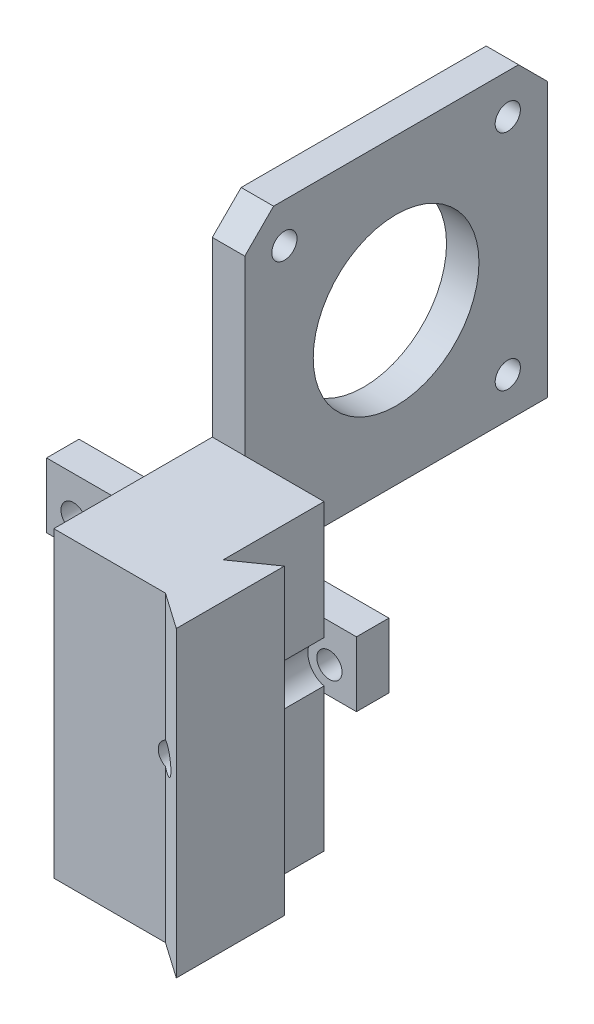
ISO-10303-21;
HEADER;
FILE_DESCRIPTION(('STEP AP214'),'2;1');
FILE_NAME('part.step','',(''),(''),'','','');
FILE_SCHEMA(('AUTOMOTIVE_DESIGN { 1 0 10303 214 1 1 1 1 }'));
ENDSEC;
DATA;
#1=APPLICATION_CONTEXT('core data for automotive mechanical design processes');
#2=APPLICATION_PROTOCOL_DEFINITION('international standard','automotive_design',2000,#1);
#3=PRODUCT_CONTEXT('',#1,'mechanical');
#4=PRODUCT('Part','Part','',(#3));
#5=PRODUCT_RELATED_PRODUCT_CATEGORY('part','',(#4));
#6=PRODUCT_DEFINITION_FORMATION('','',#4);
#7=PRODUCT_DEFINITION_CONTEXT('part definition',#1,'design');
#8=PRODUCT_DEFINITION('design','',#6,#7);
#9=PRODUCT_DEFINITION_SHAPE('','',#8);
#10=(LENGTH_UNIT() NAMED_UNIT(*) SI_UNIT(.MILLI.,.METRE.));
#11=(NAMED_UNIT(*) PLANE_ANGLE_UNIT() SI_UNIT($,.RADIAN.));
#12=(NAMED_UNIT(*) SI_UNIT($,.STERADIAN.) SOLID_ANGLE_UNIT());
#13=UNCERTAINTY_MEASURE_WITH_UNIT(LENGTH_MEASURE(1.E-05),#10,'distance_accuracy_value','');
#14=(GEOMETRIC_REPRESENTATION_CONTEXT(3) GLOBAL_UNCERTAINTY_ASSIGNED_CONTEXT((#13)) GLOBAL_UNIT_ASSIGNED_CONTEXT((#10,
#11,#12)) REPRESENTATION_CONTEXT('',''));
#15=CARTESIAN_POINT('',(0.,0.,0.));
#16=DIRECTION('',(0.,0.,1.));
#17=DIRECTION('',(1.,0.,0.));
#18=AXIS2_PLACEMENT_3D('',#15,#16,#17);
#19=CARTESIAN_POINT('',(17.75,-0.75,4.5));
#20=DIRECTION('',(0.,0.,-1.));
#21=DIRECTION('',(-1.,0.,0.));
#22=AXIS2_PLACEMENT_3D('',#19,#20,#21);
#23=CYLINDRICAL_SURFACE('',#22,1.75);
#24=CARTESIAN_POINT('',(17.75,-0.75,27.025));
#25=DIRECTION('',(-0.573462344363328,0.,0.819231920519041));
#26=DIRECTION('',(-0.819231920519041,0.,-0.573462344363328));
#27=AXIS2_PLACEMENT_3D('',#24,#25,#26);
#28=ELLIPSE('',#27,2.1361472327534,1.75);
#29=CARTESIAN_POINT('',(17.,-2.33113883008419,26.5));
#30=VERTEX_POINT('',#29);
#31=CARTESIAN_POINT('',(17.,0.831138830084191,26.5));
#32=VERTEX_POINT('',#31);
#33=EDGE_CURVE('E129',#30,#32,#28,.T.);
#34=ORIENTED_EDGE('',*,*,#33,.T.);
#35=CARTESIAN_POINT('',(17.75,-0.75,26.5));
#36=DIRECTION('',(0.,0.,-1.));
#37=DIRECTION('',(-1.,0.,0.));
#38=AXIS2_PLACEMENT_3D('',#35,#36,#37);
#39=CIRCLE('',#38,1.75);
#40=EDGE_CURVE('E115',#30,#32,#39,.T.);
#41=ORIENTED_EDGE('',*,*,#40,.F.);
#42=EDGE_LOOP('',(#34,#41));
#43=FACE_BOUND('',#42,.T.);
#44=CARTESIAN_POINT('',(17.75,-0.75,18.5));
#45=DIRECTION('',(0.,0.,-1.));
#46=DIRECTION('',(-1.,0.,0.));
#47=AXIS2_PLACEMENT_3D('',#44,#45,#46);
#48=CIRCLE('',#47,1.75);
#49=CARTESIAN_POINT('',(16.,-0.75,18.5));
#50=VERTEX_POINT('',#49);
#51=EDGE_CURVE('E971',#50,#50,#48,.T.);
#52=ORIENTED_EDGE('',*,*,#51,.T.);
#53=EDGE_LOOP('',(#52));
#54=FACE_BOUND('',#53,.T.);
#55=ADVANCED_FACE('F107',(#43,#54),#23,.F.);
#56=CARTESIAN_POINT('',(17.,-23.5,0.));
#57=DIRECTION('',(-1.,0.,0.));
#58=DIRECTION('',(0.,0.,1.));
#59=AXIS2_PLACEMENT_3D('',#56,#57,#58);
#60=PLANE('',#59);
#61=DIRECTION('',(0.,1.,0.));
#62=VECTOR('',#61,1.);
#63=CARTESIAN_POINT('',(17.,-23.5,18.5));
#64=LINE('',#63,#62);
#65=CARTESIAN_POINT('',(17.,2.15473750965556,18.5));
#66=VERTEX_POINT('',#65);
#67=CARTESIAN_POINT('',(17.,18.5,18.5));
#68=VERTEX_POINT('',#67);
#69=EDGE_CURVE('E274',#66,#68,#64,.T.);
#70=ORIENTED_EDGE('',*,*,#69,.F.);
#71=DIRECTION('',(0.,0.,-1.));
#72=VECTOR('',#71,1.);
#73=CARTESIAN_POINT('',(17.,2.15473750965556,18.5));
#74=LINE('',#73,#72);
#75=CARTESIAN_POINT('',(17.,2.15473750965556,4.5));
#76=VERTEX_POINT('',#75);
#77=EDGE_CURVE('E263',#66,#76,#74,.T.);
#78=ORIENTED_EDGE('',*,*,#77,.T.);
#79=DIRECTION('',(0.,1.,0.));
#80=VECTOR('',#79,1.);
#81=CARTESIAN_POINT('',(17.,-23.5,4.5));
#82=LINE('',#81,#80);
#83=CARTESIAN_POINT('',(17.,4.5,4.5));
#84=VERTEX_POINT('',#83);
#85=EDGE_CURVE('E271',#76,#84,#82,.T.);
#86=ORIENTED_EDGE('',*,*,#85,.T.);
#87=CARTESIAN_POINT('',(17.,18.5,4.5));
#88=VERTEX_POINT('',#87);
#89=EDGE_CURVE('E285',#84,#88,#82,.T.);
#90=ORIENTED_EDGE('',*,*,#89,.T.);
#91=DIRECTION('',(0.,0.,1.));
#92=VECTOR('',#91,1.);
#93=CARTESIAN_POINT('',(17.,18.5,0.));
#94=LINE('',#93,#92);
#95=EDGE_CURVE('E468',#88,#68,#94,.T.);
#96=ORIENTED_EDGE('',*,*,#95,.T.);
#97=EDGE_LOOP('',(#70,#78,#86,#90,#96));
#98=FACE_BOUND('',#97,.T.);
#99=ADVANCED_FACE('F270',(#98),#60,.F.);
#100=CARTESIAN_POINT('',(0.,0.,4.5));
#101=DIRECTION('',(0.,0.,-1.));
#102=DIRECTION('',(-1.,0.,0.));
#103=AXIS2_PLACEMENT_3D('',#100,#101,#102);
#104=PLANE('',#103);
#105=CARTESIAN_POINT('',(-17.75,-0.75,4.5));
#106=DIRECTION('',(0.,0.,1.));
#107=DIRECTION('',(1.,0.,0.));
#108=AXIS2_PLACEMENT_3D('',#105,#106,#107);
#109=CIRCLE('',#108,1.75);
#110=CARTESIAN_POINT('',(-16.,-0.75,4.5));
#111=VERTEX_POINT('',#110);
#112=EDGE_CURVE('E381',#111,#111,#109,.T.);
#113=ORIENTED_EDGE('',*,*,#112,.F.);
#114=EDGE_LOOP('',(#113));
#115=FACE_BOUND('',#114,.T.);
#116=DIRECTION('',(1.,0.,0.));
#117=VECTOR('',#116,1.);
#118=CARTESIAN_POINT('',(-21.5,-4.5,4.5));
#119=LINE('',#118,#117);
#120=CARTESIAN_POINT('',(-21.5,-4.5,4.5));
#121=VERTEX_POINT('',#120);
#122=CARTESIAN_POINT('',(1.5,-4.5,4.5));
#123=VERTEX_POINT('',#122);
#124=EDGE_CURVE('E396',#121,#123,#119,.T.);
#125=ORIENTED_EDGE('',*,*,#124,.T.);
#126=DIRECTION('',(0.,1.,0.));
#127=VECTOR('',#126,1.);
#128=CARTESIAN_POINT('',(1.5,-23.5,4.49999999999999));
#129=LINE('',#128,#127);
#130=CARTESIAN_POINT('',(1.5,4.5,4.5));
#131=VERTEX_POINT('',#130);
#132=EDGE_CURVE('E287',#123,#131,#129,.T.);
#133=ORIENTED_EDGE('',*,*,#132,.T.);
#134=DIRECTION('',(-1.,0.,0.));
#135=VECTOR('',#134,1.);
#136=CARTESIAN_POINT('',(-21.5,4.5,4.5));
#137=LINE('',#136,#135);
#138=CARTESIAN_POINT('',(-21.5,4.5,4.5));
#139=VERTEX_POINT('',#138);
#140=EDGE_CURVE('E389',#131,#139,#137,.T.);
#141=ORIENTED_EDGE('',*,*,#140,.T.);
#142=DIRECTION('',(0.,-1.,0.));
#143=VECTOR('',#142,1.);
#144=CARTESIAN_POINT('',(-21.5,-4.5,4.5));
#145=LINE('',#144,#143);
#146=EDGE_CURVE('E392',#139,#121,#145,.T.);
#147=ORIENTED_EDGE('',*,*,#146,.T.);
#148=EDGE_LOOP('',(#125,#133,#141,#147));
#149=FACE_BOUND('',#148,.T.);
#150=ADVANCED_FACE('F573',(#115,#149),#104,.F.);
#151=ORIENTED_EDGE('',*,*,#85,.F.);
#152=CARTESIAN_POINT('',(17.75,-0.75,4.5));
#153=DIRECTION('',(0.,0.,-1.));
#154=DIRECTION('',(-1.,0.,0.));
#155=AXIS2_PLACEMENT_3D('',#152,#153,#154);
#156=CIRCLE('',#155,3.);
#157=CARTESIAN_POINT('',(17.,-3.65473750965556,4.5));
#158=VERTEX_POINT('',#157);
#159=EDGE_CURVE('E122',#158,#76,#156,.T.);
#160=ORIENTED_EDGE('',*,*,#159,.F.);
#161=CARTESIAN_POINT('',(17.,-4.5,4.5));
#162=VERTEX_POINT('',#161);
#163=EDGE_CURVE('E282',#162,#158,#82,.T.);
#164=ORIENTED_EDGE('',*,*,#163,.F.);
#165=CARTESIAN_POINT('',(21.5,-4.5,4.5));
#166=VERTEX_POINT('',#165);
#167=EDGE_CURVE('E395',#162,#166,#119,.T.);
#168=ORIENTED_EDGE('',*,*,#167,.T.);
#169=DIRECTION('',(0.,1.,0.));
#170=VECTOR('',#169,1.);
#171=CARTESIAN_POINT('',(21.5,-4.5,4.5));
#172=LINE('',#171,#170);
#173=CARTESIAN_POINT('',(21.5,4.5,4.5));
#174=VERTEX_POINT('',#173);
#175=EDGE_CURVE('E387',#166,#174,#172,.T.);
#176=ORIENTED_EDGE('',*,*,#175,.T.);
#177=EDGE_CURVE('E280',#174,#84,#137,.T.);
#178=ORIENTED_EDGE('',*,*,#177,.T.);
#179=EDGE_LOOP('',(#151,#160,#164,#168,#176,#178));
#180=FACE_BOUND('',#179,.T.);
#181=CARTESIAN_POINT('',(17.75,-0.75,4.5));
#182=DIRECTION('',(0.,0.,1.));
#183=DIRECTION('',(-1.,0.,0.));
#184=AXIS2_PLACEMENT_3D('',#181,#182,#183);
#185=CIRCLE('',#184,1.75);
#186=CARTESIAN_POINT('',(16.,-0.75,4.5));
#187=VERTEX_POINT('',#186);
#188=EDGE_CURVE('E375',#187,#187,#185,.T.);
#189=ORIENTED_EDGE('',*,*,#188,.F.);
#190=EDGE_LOOP('',(#189));
#191=FACE_BOUND('',#190,.T.);
#192=ADVANCED_FACE('F277',(#180,#191),#104,.F.);
#193=CARTESIAN_POINT('',(-21.5,4.5,4.5));
#194=DIRECTION('',(0.,-1.,0.));
#195=DIRECTION('',(0.,0.,-1.));
#196=AXIS2_PLACEMENT_3D('',#193,#194,#195);
#197=PLANE('',#196);
#198=DIRECTION('',(0.,0.,1.));
#199=VECTOR('',#198,1.);
#200=CARTESIAN_POINT('',(1.5,4.5,-37.5));
#201=LINE('',#200,#199);
#202=CARTESIAN_POINT('',(1.5,4.5,0.));
#203=VERTEX_POINT('',#202);
#204=EDGE_CURVE('E283',#203,#131,#201,.T.);
#205=ORIENTED_EDGE('',*,*,#204,.F.);
#206=DIRECTION('',(-1.,0.,0.));
#207=VECTOR('',#206,1.);
#208=CARTESIAN_POINT('',(-21.5,4.5,0.));
#209=LINE('',#208,#207);
#210=CARTESIAN_POINT('',(-21.5,4.5,0.));
#211=VERTEX_POINT('',#210);
#212=EDGE_CURVE('E403',#203,#211,#209,.T.);
#213=ORIENTED_EDGE('',*,*,#212,.T.);
#214=DIRECTION('',(0.,0.,-1.));
#215=VECTOR('',#214,1.);
#216=CARTESIAN_POINT('',(-21.5,4.5,4.5));
#217=LINE('',#216,#215);
#218=EDGE_CURVE('E416',#139,#211,#217,.T.);
#219=ORIENTED_EDGE('',*,*,#218,.F.);
#220=ORIENTED_EDGE('',*,*,#140,.F.);
#221=EDGE_LOOP('',(#205,#213,#219,#220));
#222=FACE_BOUND('',#221,.T.);
#223=ADVANCED_FACE('F551',(#222),#197,.F.);
#224=DIRECTION('',(0.,-1.,0.));
#225=VECTOR('',#224,1.);
#226=CARTESIAN_POINT('',(1.5,4.5,4.5));
#227=LINE('',#226,#225);
#228=CARTESIAN_POINT('',(1.5,42.5,4.49999999999999));
#229=VERTEX_POINT('',#228);
#230=CARTESIAN_POINT('',(1.5,18.5,4.5));
#231=VERTEX_POINT('',#230);
#232=EDGE_CURVE('E349',#229,#231,#227,.T.);
#233=ORIENTED_EDGE('',*,*,#232,.T.);
#234=DIRECTION('',(1.,0.,0.));
#235=VECTOR('',#234,1.);
#236=CARTESIAN_POINT('',(0.,18.5,4.5));
#237=LINE('',#236,#235);
#238=CARTESIAN_POINT('',(6.,18.5,4.5));
#239=VERTEX_POINT('',#238);
#240=EDGE_CURVE('E477',#231,#239,#237,.T.);
#241=ORIENTED_EDGE('',*,*,#240,.T.);
#242=DIRECTION('',(0.,1.,0.));
#243=VECTOR('',#242,1.);
#244=CARTESIAN_POINT('',(6.,4.5,4.5));
#245=LINE('',#244,#243);
#246=CARTESIAN_POINT('',(6.,42.5,4.5));
#247=VERTEX_POINT('',#246);
#248=EDGE_CURVE('E361',#239,#247,#245,.T.);
#249=ORIENTED_EDGE('',*,*,#248,.T.);
#250=DIRECTION('',(1.,0.,0.));
#251=VECTOR('',#250,1.);
#252=CARTESIAN_POINT('',(1.5,42.5,4.49999999999999));
#253=LINE('',#252,#251);
#254=EDGE_CURVE('E310',#229,#247,#253,.T.);
#255=ORIENTED_EDGE('',*,*,#254,.F.);
#256=EDGE_LOOP('',(#233,#241,#249,#255));
#257=FACE_BOUND('',#256,.T.);
#258=ADVANCED_FACE('F525',(#257),#104,.F.);
#259=CARTESIAN_POINT('',(0.,0.,0.));
#260=DIRECTION('',(0.,0.,-1.));
#261=DIRECTION('',(-1.,0.,0.));
#262=AXIS2_PLACEMENT_3D('',#259,#260,#261);
#263=PLANE('',#262);
#264=CARTESIAN_POINT('',(-17.75,-0.75,0.));
#265=DIRECTION('',(0.,0.,1.));
#266=DIRECTION('',(1.,0.,0.));
#267=AXIS2_PLACEMENT_3D('',#264,#265,#266);
#268=CIRCLE('',#267,1.75);
#269=CARTESIAN_POINT('',(-16.,-0.75,0.));
#270=VERTEX_POINT('',#269);
#271=EDGE_CURVE('E378',#270,#270,#268,.T.);
#272=ORIENTED_EDGE('',*,*,#271,.T.);
#273=EDGE_LOOP('',(#272));
#274=FACE_BOUND('',#273,.T.);
#275=DIRECTION('',(0.,1.,0.));
#276=VECTOR('',#275,1.);
#277=CARTESIAN_POINT('',(21.5,-4.5,0.));
#278=LINE('',#277,#276);
#279=CARTESIAN_POINT('',(21.5,-4.5,0.));
#280=VERTEX_POINT('',#279);
#281=CARTESIAN_POINT('',(21.5,4.5,0.));
#282=VERTEX_POINT('',#281);
#283=EDGE_CURVE('E384',#280,#282,#278,.T.);
#284=ORIENTED_EDGE('',*,*,#283,.F.);
#285=DIRECTION('',(1.,0.,0.));
#286=VECTOR('',#285,1.);
#287=CARTESIAN_POINT('',(-21.5,-4.5,0.));
#288=LINE('',#287,#286);
#289=CARTESIAN_POINT('',(-21.5,-4.5,0.));
#290=VERTEX_POINT('',#289);
#291=EDGE_CURVE('E390',#290,#280,#288,.T.);
#292=ORIENTED_EDGE('',*,*,#291,.F.);
#293=DIRECTION('',(0.,-1.,0.));
#294=VECTOR('',#293,1.);
#295=CARTESIAN_POINT('',(-21.5,-4.5,0.));
#296=LINE('',#295,#294);
#297=EDGE_CURVE('E407',#211,#290,#296,.T.);
#298=ORIENTED_EDGE('',*,*,#297,.F.);
#299=ORIENTED_EDGE('',*,*,#212,.F.);
#300=CARTESIAN_POINT('',(6.,4.5,0.));
#301=VERTEX_POINT('',#300);
#302=EDGE_CURVE('E408',#301,#203,#209,.T.);
#303=ORIENTED_EDGE('',*,*,#302,.F.);
#304=EDGE_CURVE('E404',#282,#301,#209,.T.);
#305=ORIENTED_EDGE('',*,*,#304,.F.);
#306=EDGE_LOOP('',(#284,#292,#298,#299,#303,#305));
#307=FACE_BOUND('',#306,.T.);
#308=CARTESIAN_POINT('',(17.75,-0.75,0.));
#309=DIRECTION('',(0.,0.,1.));
#310=DIRECTION('',(-1.,0.,0.));
#311=AXIS2_PLACEMENT_3D('',#308,#309,#310);
#312=CIRCLE('',#311,1.75);
#313=CARTESIAN_POINT('',(16.,-0.75,0.));
#314=VERTEX_POINT('',#313);
#315=EDGE_CURVE('E367',#314,#314,#312,.T.);
#316=ORIENTED_EDGE('',*,*,#315,.T.);
#317=EDGE_LOOP('',(#316));
#318=FACE_BOUND('',#317,.T.);
#319=ADVANCED_FACE('F541',(#274,#307,#318),#263,.T.);
#320=CARTESIAN_POINT('',(21.5,-4.5,4.5));
#321=DIRECTION('',(-1.,0.,0.));
#322=DIRECTION('',(0.,0.,1.));
#323=AXIS2_PLACEMENT_3D('',#320,#321,#322);
#324=PLANE('',#323);
#325=ORIENTED_EDGE('',*,*,#283,.T.);
#326=DIRECTION('',(0.,0.,-1.));
#327=VECTOR('',#326,1.);
#328=CARTESIAN_POINT('',(21.5,4.5,4.5));
#329=LINE('',#328,#327);
#330=EDGE_CURVE('E419',#174,#282,#329,.T.);
#331=ORIENTED_EDGE('',*,*,#330,.F.);
#332=ORIENTED_EDGE('',*,*,#175,.F.);
#333=DIRECTION('',(0.,0.,-1.));
#334=VECTOR('',#333,1.);
#335=CARTESIAN_POINT('',(21.5,-4.5,4.5));
#336=LINE('',#335,#334);
#337=EDGE_CURVE('E399',#166,#280,#336,.T.);
#338=ORIENTED_EDGE('',*,*,#337,.T.);
#339=EDGE_LOOP('',(#325,#331,#332,#338));
#340=FACE_BOUND('',#339,.T.);
#341=ADVANCED_FACE('F109',(#340),#324,.F.);
#342=ORIENTED_EDGE('',*,*,#304,.T.);
#343=DIRECTION('',(0.,0.,1.));
#344=VECTOR('',#343,1.);
#345=CARTESIAN_POINT('',(6.,4.5,-37.5));
#346=LINE('',#345,#344);
#347=CARTESIAN_POINT('',(6.,4.5,4.5));
#348=VERTEX_POINT('',#347);
#349=EDGE_CURVE('E289',#301,#348,#346,.T.);
#350=ORIENTED_EDGE('',*,*,#349,.T.);
#351=EDGE_CURVE('E393',#84,#348,#137,.T.);
#352=ORIENTED_EDGE('',*,*,#351,.F.);
#353=ORIENTED_EDGE('',*,*,#177,.F.);
#354=ORIENTED_EDGE('',*,*,#330,.T.);
#355=EDGE_LOOP('',(#342,#350,#352,#353,#354));
#356=FACE_BOUND('',#355,.T.);
#357=ADVANCED_FACE('F536',(#356),#197,.F.);
#358=CARTESIAN_POINT('',(-21.5,-4.5,4.5));
#359=DIRECTION('',(1.,0.,0.));
#360=DIRECTION('',(0.,0.,-1.));
#361=AXIS2_PLACEMENT_3D('',#358,#359,#360);
#362=PLANE('',#361);
#363=ORIENTED_EDGE('',*,*,#297,.T.);
#364=DIRECTION('',(0.,0.,-1.));
#365=VECTOR('',#364,1.);
#366=CARTESIAN_POINT('',(-21.5,-4.5,4.5));
#367=LINE('',#366,#365);
#368=EDGE_CURVE('E413',#121,#290,#367,.T.);
#369=ORIENTED_EDGE('',*,*,#368,.F.);
#370=ORIENTED_EDGE('',*,*,#146,.F.);
#371=ORIENTED_EDGE('',*,*,#218,.T.);
#372=EDGE_LOOP('',(#363,#369,#370,#371));
#373=FACE_BOUND('',#372,.T.);
#374=ADVANCED_FACE('F555',(#373),#362,.F.);
#375=CARTESIAN_POINT('',(-21.5,-4.5,4.5));
#376=DIRECTION('',(0.,1.,0.));
#377=DIRECTION('',(0.,0.,1.));
#378=AXIS2_PLACEMENT_3D('',#375,#376,#377);
#379=PLANE('',#378);
#380=ORIENTED_EDGE('',*,*,#291,.T.);
#381=ORIENTED_EDGE('',*,*,#337,.F.);
#382=ORIENTED_EDGE('',*,*,#167,.F.);
#383=EDGE_CURVE('E400',#123,#162,#119,.T.);
#384=ORIENTED_EDGE('',*,*,#383,.F.);
#385=ORIENTED_EDGE('',*,*,#124,.F.);
#386=ORIENTED_EDGE('',*,*,#368,.T.);
#387=EDGE_LOOP('',(#380,#381,#382,#384,#385,#386));
#388=FACE_BOUND('',#387,.T.);
#389=ADVANCED_FACE('F514',(#388),#379,.F.);
#390=CARTESIAN_POINT('',(-17.75,-0.75,4.5));
#391=DIRECTION('',(0.,0.,-1.));
#392=DIRECTION('',(-1.,0.,0.));
#393=AXIS2_PLACEMENT_3D('',#390,#391,#392);
#394=CYLINDRICAL_SURFACE('',#393,1.75);
#395=ORIENTED_EDGE('',*,*,#112,.T.);
#396=EDGE_LOOP('',(#395));
#397=FACE_BOUND('',#396,.T.);
#398=ORIENTED_EDGE('',*,*,#271,.F.);
#399=EDGE_LOOP('',(#398));
#400=FACE_BOUND('',#399,.T.);
#401=ADVANCED_FACE('F579',(#397,#400),#394,.F.);
#402=ORIENTED_EDGE('',*,*,#188,.T.);
#403=EDGE_LOOP('',(#402));
#404=FACE_BOUND('',#403,.T.);
#405=ORIENTED_EDGE('',*,*,#315,.F.);
#406=EDGE_LOOP('',(#405));
#407=FACE_BOUND('',#406,.T.);
#408=ADVANCED_FACE('F568',(#404,#407),#23,.F.);
#409=CARTESIAN_POINT('',(1.5,4.5,-37.5));
#410=DIRECTION('',(-1.,0.,0.));
#411=DIRECTION('',(0.,0.,1.));
#412=AXIS2_PLACEMENT_3D('',#409,#410,#411);
#413=PLANE('',#412);
#414=DIRECTION('',(0.,0.707106781186547,-0.707106781186548));
#415=VECTOR('',#414,1.);
#416=CARTESIAN_POINT('',(1.5,46.5,0.49999999999998));
#417=LINE('',#416,#415);
#418=CARTESIAN_POINT('',(1.5,46.5,0.49999999999998));
#419=VERTEX_POINT('',#418);
#420=EDGE_CURVE('E313',#229,#419,#417,.T.);
#421=ORIENTED_EDGE('',*,*,#420,.T.);
#422=DIRECTION('',(0.,0.,1.));
#423=VECTOR('',#422,1.);
#424=CARTESIAN_POINT('',(1.5,46.5,-37.5));
#425=LINE('',#424,#423);
#426=CARTESIAN_POINT('',(1.5,46.5,-33.5));
#427=VERTEX_POINT('',#426);
#428=EDGE_CURVE('E364',#427,#419,#425,.T.);
#429=ORIENTED_EDGE('',*,*,#428,.F.);
#430=DIRECTION('',(0.,-0.707106781186547,-0.707106781186548));
#431=VECTOR('',#430,1.);
#432=CARTESIAN_POINT('',(1.5,46.5,-33.5));
#433=LINE('',#432,#431);
#434=CARTESIAN_POINT('',(1.5,42.5,-37.5));
#435=VERTEX_POINT('',#434);
#436=EDGE_CURVE('E341',#427,#435,#433,.T.);
#437=ORIENTED_EDGE('',*,*,#436,.T.);
#438=DIRECTION('',(0.,-1.,0.));
#439=VECTOR('',#438,1.);
#440=CARTESIAN_POINT('',(1.5,4.5,-37.5));
#441=LINE('',#440,#439);
#442=CARTESIAN_POINT('',(1.5,4.5,-37.5));
#443=VERTEX_POINT('',#442);
#444=EDGE_CURVE('E351',#435,#443,#441,.T.);
#445=ORIENTED_EDGE('',*,*,#444,.T.);
#446=EDGE_CURVE('E291',#443,#203,#201,.T.);
#447=ORIENTED_EDGE('',*,*,#446,.T.);
#448=ORIENTED_EDGE('',*,*,#204,.T.);
#449=ORIENTED_EDGE('',*,*,#132,.F.);
#450=CARTESIAN_POINT('',(1.5,-23.5,4.49999999999999));
#451=VERTEX_POINT('',#450);
#452=EDGE_CURVE('E425',#451,#123,#129,.T.);
#453=ORIENTED_EDGE('',*,*,#452,.F.);
#454=DIRECTION('',(0.,0.,1.));
#455=VECTOR('',#454,1.);
#456=CARTESIAN_POINT('',(1.5,-23.5,4.49999999999999));
#457=LINE('',#456,#455);
#458=CARTESIAN_POINT('',(1.5,-23.5,26.5));
#459=VERTEX_POINT('',#458);
#460=EDGE_CURVE('E432',#451,#459,#457,.T.);
#461=ORIENTED_EDGE('',*,*,#460,.T.);
#462=DIRECTION('',(0.,1.,0.));
#463=VECTOR('',#462,1.);
#464=CARTESIAN_POINT('',(1.5,-23.5,26.5));
#465=LINE('',#464,#463);
#466=CARTESIAN_POINT('',(1.5,18.5,26.5));
#467=VERTEX_POINT('',#466);
#468=EDGE_CURVE('E431',#459,#467,#465,.T.);
#469=ORIENTED_EDGE('',*,*,#468,.T.);
#470=DIRECTION('',(0.,0.,1.));
#471=VECTOR('',#470,1.);
#472=CARTESIAN_POINT('',(1.5,18.5,4.49999999999999));
#473=LINE('',#472,#471);
#474=EDGE_CURVE('E439',#231,#467,#473,.T.);
#475=ORIENTED_EDGE('',*,*,#474,.F.);
#476=ORIENTED_EDGE('',*,*,#232,.F.);
#477=EDGE_LOOP('',(#421,#429,#437,#445,#447,#448,#449,#453,#461,#469,#475,#476));
#478=FACE_BOUND('',#477,.T.);
#479=CARTESIAN_POINT('',(1.5,25.5,-16.5));
#480=DIRECTION('',(1.,0.,0.));
#481=DIRECTION('',(0.,0.,-1.));
#482=AXIS2_PLACEMENT_3D('',#479,#480,#481);
#483=CIRCLE('',#482,11.5);
#484=CARTESIAN_POINT('',(1.5,25.5,-28.));
#485=VERTEX_POINT('',#484);
#486=EDGE_CURVE('E325',#485,#485,#483,.T.);
#487=ORIENTED_EDGE('',*,*,#486,.T.);
#488=EDGE_LOOP('',(#487));
#489=FACE_BOUND('',#488,.T.);
#490=CARTESIAN_POINT('',(1.5,41.,-32.));
#491=DIRECTION('',(1.,0.,0.));
#492=DIRECTION('',(0.,0.,-1.));
#493=AXIS2_PLACEMENT_3D('',#490,#491,#492);
#494=CIRCLE('',#493,1.75);
#495=CARTESIAN_POINT('',(1.5,41.,-33.75));
#496=VERTEX_POINT('',#495);
#497=EDGE_CURVE('E331',#496,#496,#494,.T.);
#498=ORIENTED_EDGE('',*,*,#497,.T.);
#499=EDGE_LOOP('',(#498));
#500=FACE_BOUND('',#499,.T.);
#501=CARTESIAN_POINT('',(1.5,10.,-32.));
#502=DIRECTION('',(1.,0.,0.));
#503=DIRECTION('',(0.,0.,1.));
#504=AXIS2_PLACEMENT_3D('',#501,#502,#503);
#505=CIRCLE('',#504,1.75);
#506=CARTESIAN_POINT('',(1.5,10.,-30.25));
#507=VERTEX_POINT('',#506);
#508=EDGE_CURVE('E337',#507,#507,#505,.T.);
#509=ORIENTED_EDGE('',*,*,#508,.T.);
#510=EDGE_LOOP('',(#509));
#511=FACE_BOUND('',#510,.T.);
#512=CARTESIAN_POINT('',(1.5,10.,-1.00000000000002));
#513=DIRECTION('',(1.,0.,0.));
#514=DIRECTION('',(0.,0.,-1.));
#515=AXIS2_PLACEMENT_3D('',#512,#513,#514);
#516=CIRCLE('',#515,1.75);
#517=CARTESIAN_POINT('',(1.5,10.,-2.75000000000003));
#518=VERTEX_POINT('',#517);
#519=EDGE_CURVE('E306',#518,#518,#516,.T.);
#520=ORIENTED_EDGE('',*,*,#519,.T.);
#521=EDGE_LOOP('',(#520));
#522=FACE_BOUND('',#521,.T.);
#523=CARTESIAN_POINT('',(1.5,41.,-1.00000000000002));
#524=DIRECTION('',(1.,0.,0.));
#525=DIRECTION('',(0.,0.,1.));
#526=AXIS2_PLACEMENT_3D('',#523,#524,#525);
#527=CIRCLE('',#526,1.75);
#528=CARTESIAN_POINT('',(1.5,41.,0.749999999999982));
#529=VERTEX_POINT('',#528);
#530=EDGE_CURVE('E296',#529,#529,#527,.T.);
#531=ORIENTED_EDGE('',*,*,#530,.T.);
#532=EDGE_LOOP('',(#531));
#533=FACE_BOUND('',#532,.T.);
#534=ADVANCED_FACE('F518',(#478,#489,#500,#511,#522,#533),#413,.T.);
#535=CARTESIAN_POINT('',(1.5,46.5,-37.5));
#536=DIRECTION('',(0.,1.,0.));
#537=DIRECTION('',(0.,0.,1.));
#538=AXIS2_PLACEMENT_3D('',#535,#536,#537);
#539=PLANE('',#538);
#540=DIRECTION('',(1.,0.,0.));
#541=VECTOR('',#540,1.);
#542=CARTESIAN_POINT('',(1.5,46.5,0.49999999999998));
#543=LINE('',#542,#541);
#544=CARTESIAN_POINT('',(6.,46.5,0.49999999999998));
#545=VERTEX_POINT('',#544);
#546=EDGE_CURVE('E314',#419,#545,#543,.T.);
#547=ORIENTED_EDGE('',*,*,#546,.T.);
#548=DIRECTION('',(0.,0.,1.));
#549=VECTOR('',#548,1.);
#550=CARTESIAN_POINT('',(6.,46.5,-37.5));
#551=LINE('',#550,#549);
#552=CARTESIAN_POINT('',(6.,46.5,-33.5));
#553=VERTEX_POINT('',#552);
#554=EDGE_CURVE('E368',#553,#545,#551,.T.);
#555=ORIENTED_EDGE('',*,*,#554,.F.);
#556=DIRECTION('',(1.,0.,0.));
#557=VECTOR('',#556,1.);
#558=CARTESIAN_POINT('',(1.5,46.5,-33.5));
#559=LINE('',#558,#557);
#560=EDGE_CURVE('E344',#427,#553,#559,.T.);
#561=ORIENTED_EDGE('',*,*,#560,.F.);
#562=ORIENTED_EDGE('',*,*,#428,.T.);
#563=EDGE_LOOP('',(#547,#555,#561,#562));
#564=FACE_BOUND('',#563,.T.);
#565=ADVANCED_FACE('F586',(#564),#539,.T.);
#566=CARTESIAN_POINT('',(6.,4.5,-37.5));
#567=DIRECTION('',(1.,0.,0.));
#568=DIRECTION('',(0.,0.,-1.));
#569=AXIS2_PLACEMENT_3D('',#566,#567,#568);
#570=PLANE('',#569);
#571=DIRECTION('',(0.,0.707106781186547,-0.707106781186548));
#572=VECTOR('',#571,1.);
#573=CARTESIAN_POINT('',(6.,46.5,0.49999999999998));
#574=LINE('',#573,#572);
#575=EDGE_CURVE('E318',#247,#545,#574,.T.);
#576=ORIENTED_EDGE('',*,*,#575,.F.);
#577=ORIENTED_EDGE('',*,*,#248,.F.);
#578=EDGE_CURVE('E354',#348,#239,#245,.T.);
#579=ORIENTED_EDGE('',*,*,#578,.F.);
#580=ORIENTED_EDGE('',*,*,#349,.F.);
#581=CARTESIAN_POINT('',(6.,4.5,-37.5));
#582=VERTEX_POINT('',#581);
#583=EDGE_CURVE('E371',#582,#301,#346,.T.);
#584=ORIENTED_EDGE('',*,*,#583,.F.);
#585=DIRECTION('',(0.,1.,0.));
#586=VECTOR('',#585,1.);
#587=CARTESIAN_POINT('',(6.,4.5,-37.5));
#588=LINE('',#587,#586);
#589=CARTESIAN_POINT('',(6.,42.5,-37.5));
#590=VERTEX_POINT('',#589);
#591=EDGE_CURVE('E357',#582,#590,#588,.T.);
#592=ORIENTED_EDGE('',*,*,#591,.T.);
#593=DIRECTION('',(0.,-0.707106781186547,-0.707106781186548));
#594=VECTOR('',#593,1.);
#595=CARTESIAN_POINT('',(6.,46.5,-33.5));
#596=LINE('',#595,#594);
#597=EDGE_CURVE('E320',#553,#590,#596,.T.);
#598=ORIENTED_EDGE('',*,*,#597,.F.);
#599=ORIENTED_EDGE('',*,*,#554,.T.);
#600=EDGE_LOOP('',(#576,#577,#579,#580,#584,#592,#598,#599));
#601=FACE_BOUND('',#600,.T.);
#602=CARTESIAN_POINT('',(6.,25.5,-16.5));
#603=DIRECTION('',(1.,0.,0.));
#604=DIRECTION('',(0.,0.,-1.));
#605=AXIS2_PLACEMENT_3D('',#602,#603,#604);
#606=CIRCLE('',#605,11.5);
#607=CARTESIAN_POINT('',(6.,25.5,-28.));
#608=VERTEX_POINT('',#607);
#609=EDGE_CURVE('E317',#608,#608,#606,.T.);
#610=ORIENTED_EDGE('',*,*,#609,.F.);
#611=EDGE_LOOP('',(#610));
#612=FACE_BOUND('',#611,.T.);
#613=CARTESIAN_POINT('',(6.,41.,-32.));
#614=DIRECTION('',(1.,0.,0.));
#615=DIRECTION('',(0.,0.,-1.));
#616=AXIS2_PLACEMENT_3D('',#613,#614,#615);
#617=CIRCLE('',#616,1.75);
#618=CARTESIAN_POINT('',(6.,41.,-33.75));
#619=VERTEX_POINT('',#618);
#620=EDGE_CURVE('E328',#619,#619,#617,.T.);
#621=ORIENTED_EDGE('',*,*,#620,.F.);
#622=EDGE_LOOP('',(#621));
#623=FACE_BOUND('',#622,.T.);
#624=CARTESIAN_POINT('',(6.,10.,-32.));
#625=DIRECTION('',(1.,0.,0.));
#626=DIRECTION('',(0.,0.,1.));
#627=AXIS2_PLACEMENT_3D('',#624,#625,#626);
#628=CIRCLE('',#627,1.75);
#629=CARTESIAN_POINT('',(6.,10.,-30.25));
#630=VERTEX_POINT('',#629);
#631=EDGE_CURVE('E334',#630,#630,#628,.T.);
#632=ORIENTED_EDGE('',*,*,#631,.F.);
#633=EDGE_LOOP('',(#632));
#634=FACE_BOUND('',#633,.T.);
#635=CARTESIAN_POINT('',(6.,10.,-1.00000000000002));
#636=DIRECTION('',(1.,0.,0.));
#637=DIRECTION('',(0.,0.,-1.));
#638=AXIS2_PLACEMENT_3D('',#635,#636,#637);
#639=CIRCLE('',#638,1.75);
#640=CARTESIAN_POINT('',(6.,10.,-2.75000000000003));
#641=VERTEX_POINT('',#640);
#642=EDGE_CURVE('E340',#641,#641,#639,.T.);
#643=ORIENTED_EDGE('',*,*,#642,.F.);
#644=EDGE_LOOP('',(#643));
#645=FACE_BOUND('',#644,.T.);
#646=CARTESIAN_POINT('',(6.,41.,-1.00000000000002));
#647=DIRECTION('',(1.,0.,0.));
#648=DIRECTION('',(0.,0.,1.));
#649=AXIS2_PLACEMENT_3D('',#646,#647,#648);
#650=CIRCLE('',#649,1.75);
#651=CARTESIAN_POINT('',(6.,41.,0.749999999999982));
#652=VERTEX_POINT('',#651);
#653=EDGE_CURVE('E301',#652,#652,#650,.T.);
#654=ORIENTED_EDGE('',*,*,#653,.F.);
#655=EDGE_LOOP('',(#654));
#656=FACE_BOUND('',#655,.T.);
#657=ADVANCED_FACE('F533',(#601,#612,#623,#634,#645,#656),#570,.T.);
#658=CARTESIAN_POINT('',(1.5,4.5,-37.5));
#659=DIRECTION('',(0.,-1.,0.));
#660=DIRECTION('',(0.,0.,-1.));
#661=AXIS2_PLACEMENT_3D('',#658,#659,#660);
#662=PLANE('',#661);
#663=ORIENTED_EDGE('',*,*,#583,.T.);
#664=ORIENTED_EDGE('',*,*,#302,.T.);
#665=ORIENTED_EDGE('',*,*,#446,.F.);
#666=DIRECTION('',(1.,0.,0.));
#667=VECTOR('',#666,1.);
#668=CARTESIAN_POINT('',(1.5,4.5,-37.5));
#669=LINE('',#668,#667);
#670=EDGE_CURVE('E353',#443,#582,#669,.T.);
#671=ORIENTED_EDGE('',*,*,#670,.T.);
#672=EDGE_LOOP('',(#663,#664,#665,#671));
#673=FACE_BOUND('',#672,.T.);
#674=ADVANCED_FACE('F631',(#673),#662,.T.);
#675=CARTESIAN_POINT('',(0.,0.,-37.5));
#676=DIRECTION('',(0.,0.,-1.));
#677=DIRECTION('',(-1.,0.,0.));
#678=AXIS2_PLACEMENT_3D('',#675,#676,#677);
#679=PLANE('',#678);
#680=DIRECTION('',(1.,0.,0.));
#681=VECTOR('',#680,1.);
#682=CARTESIAN_POINT('',(1.5,42.5,-37.5));
#683=LINE('',#682,#681);
#684=EDGE_CURVE('E346',#435,#590,#683,.T.);
#685=ORIENTED_EDGE('',*,*,#684,.T.);
#686=ORIENTED_EDGE('',*,*,#591,.F.);
#687=ORIENTED_EDGE('',*,*,#670,.F.);
#688=ORIENTED_EDGE('',*,*,#444,.F.);
#689=EDGE_LOOP('',(#685,#686,#687,#688));
#690=FACE_BOUND('',#689,.T.);
#691=ADVANCED_FACE('F845',(#690),#679,.T.);
#692=CARTESIAN_POINT('',(1.5,46.5,-33.5));
#693=DIRECTION('',(0.,-0.707106781186548,0.707106781186547));
#694=DIRECTION('',(0.,-0.707106781186547,-0.707106781186548));
#695=AXIS2_PLACEMENT_3D('',#692,#693,#694);
#696=PLANE('',#695);
#697=ORIENTED_EDGE('',*,*,#597,.T.);
#698=ORIENTED_EDGE('',*,*,#684,.F.);
#699=ORIENTED_EDGE('',*,*,#436,.F.);
#700=ORIENTED_EDGE('',*,*,#560,.T.);
#701=EDGE_LOOP('',(#697,#698,#699,#700));
#702=FACE_BOUND('',#701,.T.);
#703=ADVANCED_FACE('F836',(#702),#696,.F.);
#704=CARTESIAN_POINT('',(1.5,41.,-1.00000000000002));
#705=DIRECTION('',(1.,0.,0.));
#706=DIRECTION('',(0.,0.,-1.));
#707=AXIS2_PLACEMENT_3D('',#704,#705,#706);
#708=CYLINDRICAL_SURFACE('',#707,1.75);
#709=ORIENTED_EDGE('',*,*,#530,.F.);
#710=EDGE_LOOP('',(#709));
#711=FACE_BOUND('',#710,.T.);
#712=ORIENTED_EDGE('',*,*,#653,.T.);
#713=EDGE_LOOP('',(#712));
#714=FACE_BOUND('',#713,.T.);
#715=ADVANCED_FACE('F827',(#711,#714),#708,.F.);
#716=CARTESIAN_POINT('',(1.5,10.,-1.00000000000002));
#717=DIRECTION('',(1.,0.,0.));
#718=DIRECTION('',(0.,0.,-1.));
#719=AXIS2_PLACEMENT_3D('',#716,#717,#718);
#720=CYLINDRICAL_SURFACE('',#719,1.75);
#721=ORIENTED_EDGE('',*,*,#519,.F.);
#722=EDGE_LOOP('',(#721));
#723=FACE_BOUND('',#722,.T.);
#724=ORIENTED_EDGE('',*,*,#642,.T.);
#725=EDGE_LOOP('',(#724));
#726=FACE_BOUND('',#725,.T.);
#727=ADVANCED_FACE('F818',(#723,#726),#720,.F.);
#728=CARTESIAN_POINT('',(1.5,10.,-32.));
#729=DIRECTION('',(1.,0.,0.));
#730=DIRECTION('',(0.,0.,-1.));
#731=AXIS2_PLACEMENT_3D('',#728,#729,#730);
#732=CYLINDRICAL_SURFACE('',#731,1.75);
#733=ORIENTED_EDGE('',*,*,#508,.F.);
#734=EDGE_LOOP('',(#733));
#735=FACE_BOUND('',#734,.T.);
#736=ORIENTED_EDGE('',*,*,#631,.T.);
#737=EDGE_LOOP('',(#736));
#738=FACE_BOUND('',#737,.T.);
#739=ADVANCED_FACE('F809',(#735,#738),#732,.F.);
#740=CARTESIAN_POINT('',(1.5,41.,-32.));
#741=DIRECTION('',(1.,0.,0.));
#742=DIRECTION('',(0.,0.,-1.));
#743=AXIS2_PLACEMENT_3D('',#740,#741,#742);
#744=CYLINDRICAL_SURFACE('',#743,1.75);
#745=ORIENTED_EDGE('',*,*,#497,.F.);
#746=EDGE_LOOP('',(#745));
#747=FACE_BOUND('',#746,.T.);
#748=ORIENTED_EDGE('',*,*,#620,.T.);
#749=EDGE_LOOP('',(#748));
#750=FACE_BOUND('',#749,.T.);
#751=ADVANCED_FACE('F800',(#747,#750),#744,.F.);
#752=CARTESIAN_POINT('',(1.5,25.5,-16.5));
#753=DIRECTION('',(1.,0.,0.));
#754=DIRECTION('',(0.,0.,-1.));
#755=AXIS2_PLACEMENT_3D('',#752,#753,#754);
#756=CYLINDRICAL_SURFACE('',#755,11.5);
#757=ORIENTED_EDGE('',*,*,#486,.F.);
#758=EDGE_LOOP('',(#757));
#759=FACE_BOUND('',#758,.T.);
#760=ORIENTED_EDGE('',*,*,#609,.T.);
#761=EDGE_LOOP('',(#760));
#762=FACE_BOUND('',#761,.T.);
#763=ADVANCED_FACE('F791',(#759,#762),#756,.F.);
#764=CARTESIAN_POINT('',(1.5,46.5,0.49999999999998));
#765=DIRECTION('',(0.,-0.707106781186548,-0.707106781186547));
#766=DIRECTION('',(0.,0.707106781186547,-0.707106781186548));
#767=AXIS2_PLACEMENT_3D('',#764,#765,#766);
#768=PLANE('',#767);
#769=ORIENTED_EDGE('',*,*,#575,.T.);
#770=ORIENTED_EDGE('',*,*,#546,.F.);
#771=ORIENTED_EDGE('',*,*,#420,.F.);
#772=ORIENTED_EDGE('',*,*,#254,.T.);
#773=EDGE_LOOP('',(#769,#770,#771,#772));
#774=FACE_BOUND('',#773,.T.);
#775=ADVANCED_FACE('F641',(#774),#768,.F.);
#776=CARTESIAN_POINT('',(0.,-23.5,4.5));
#777=DIRECTION('',(0.,0.,1.));
#778=DIRECTION('',(1.,0.,0.));
#779=AXIS2_PLACEMENT_3D('',#776,#777,#778);
#780=PLANE('',#779);
#781=ORIENTED_EDGE('',*,*,#452,.T.);
#782=ORIENTED_EDGE('',*,*,#383,.T.);
#783=CARTESIAN_POINT('',(17.,-23.5,4.5));
#784=VERTEX_POINT('',#783);
#785=EDGE_CURVE('E286',#784,#162,#82,.T.);
#786=ORIENTED_EDGE('',*,*,#785,.F.);
#787=DIRECTION('',(1.,0.,0.));
#788=VECTOR('',#787,1.);
#789=CARTESIAN_POINT('',(0.,-23.5,4.5));
#790=LINE('',#789,#788);
#791=EDGE_CURVE('E491',#451,#784,#790,.T.);
#792=ORIENTED_EDGE('',*,*,#791,.F.);
#793=EDGE_LOOP('',(#781,#782,#786,#792));
#794=FACE_BOUND('',#793,.T.);
#795=ADVANCED_FACE('F517',(#794),#780,.F.);
#796=ORIENTED_EDGE('',*,*,#351,.T.);
#797=ORIENTED_EDGE('',*,*,#578,.T.);
#798=EDGE_CURVE('E475',#239,#88,#237,.T.);
#799=ORIENTED_EDGE('',*,*,#798,.T.);
#800=ORIENTED_EDGE('',*,*,#89,.F.);
#801=EDGE_LOOP('',(#796,#797,#799,#800));
#802=FACE_BOUND('',#801,.T.);
#803=ADVANCED_FACE('F529',(#802),#780,.F.);
#804=CARTESIAN_POINT('',(0.,18.5,0.));
#805=DIRECTION('',(0.,1.,0.));
#806=DIRECTION('',(0.,0.,1.));
#807=AXIS2_PLACEMENT_3D('',#804,#805,#806);
#808=PLANE('',#807);
#809=DIRECTION('',(-1.,0.,0.));
#810=VECTOR('',#809,1.);
#811=CARTESIAN_POINT('',(0.,18.5,26.5));
#812=LINE('',#811,#810);
#813=CARTESIAN_POINT('',(17.,18.5,26.5));
#814=VERTEX_POINT('',#813);
#815=EDGE_CURVE('E437',#814,#467,#812,.T.);
#816=ORIENTED_EDGE('',*,*,#815,.F.);
#817=DIRECTION('',(0.819231920519041,0.,0.573462344363328));
#818=VECTOR('',#817,1.);
#819=CARTESIAN_POINT('',(-6.85906040268456,18.5,9.79865771812082));
#820=LINE('',#819,#818);
#821=CARTESIAN_POINT('',(22.,18.5,30.));
#822=VERTEX_POINT('',#821);
#823=EDGE_CURVE('E497',#814,#822,#820,.T.);
#824=ORIENTED_EDGE('',*,*,#823,.T.);
#825=DIRECTION('',(0.,0.,1.));
#826=VECTOR('',#825,1.);
#827=CARTESIAN_POINT('',(22.,18.5,0.));
#828=LINE('',#827,#826);
#829=CARTESIAN_POINT('',(22.,18.5,15.));
#830=VERTEX_POINT('',#829);
#831=EDGE_CURVE('E471',#830,#822,#828,.T.);
#832=ORIENTED_EDGE('',*,*,#831,.F.);
#833=DIRECTION('',(0.819231920519041,0.,-0.573462344363328));
#834=VECTOR('',#833,1.);
#835=CARTESIAN_POINT('',(14.2818791946309,18.5,20.4026845637584));
#836=LINE('',#835,#834);
#837=EDGE_CURVE('E461',#68,#830,#836,.T.);
#838=ORIENTED_EDGE('',*,*,#837,.F.);
#839=ORIENTED_EDGE('',*,*,#95,.F.);
#840=ORIENTED_EDGE('',*,*,#798,.F.);
#841=ORIENTED_EDGE('',*,*,#240,.F.);
#842=ORIENTED_EDGE('',*,*,#474,.T.);
#843=EDGE_LOOP('',(#816,#824,#832,#838,#839,#840,#841,#842));
#844=FACE_BOUND('',#843,.T.);
#845=ADVANCED_FACE('F466',(#844),#808,.T.);
#846=CARTESIAN_POINT('',(-6.85906040268456,-23.5,9.79865771812082));
#847=DIRECTION('',(-0.573462344363328,0.,0.819231920519041));
#848=DIRECTION('',(0.819231920519041,0.,0.573462344363328));
#849=AXIS2_PLACEMENT_3D('',#846,#847,#848);
#850=PLANE('',#849);
#851=ORIENTED_EDGE('',*,*,#33,.F.);
#852=DIRECTION('',(0.,1.,0.));
#853=VECTOR('',#852,1.);
#854=CARTESIAN_POINT('',(17.,-23.5,26.5));
#855=LINE('',#854,#853);
#856=CARTESIAN_POINT('',(17.,-23.5,26.5));
#857=VERTEX_POINT('',#856);
#858=EDGE_CURVE('E446',#857,#30,#855,.T.);
#859=ORIENTED_EDGE('',*,*,#858,.F.);
#860=DIRECTION('',(0.819231920519041,0.,0.573462344363328));
#861=VECTOR('',#860,1.);
#862=CARTESIAN_POINT('',(-6.85906040268456,-23.5,9.79865771812082));
#863=LINE('',#862,#861);
#864=CARTESIAN_POINT('',(22.,-23.5,30.));
#865=VERTEX_POINT('',#864);
#866=EDGE_CURVE('E483',#857,#865,#863,.T.);
#867=ORIENTED_EDGE('',*,*,#866,.T.);
#868=DIRECTION('',(0.,1.,0.));
#869=VECTOR('',#868,1.);
#870=CARTESIAN_POINT('',(22.,-23.5,30.));
#871=LINE('',#870,#869);
#872=EDGE_CURVE('E448',#865,#822,#871,.T.);
#873=ORIENTED_EDGE('',*,*,#872,.T.);
#874=ORIENTED_EDGE('',*,*,#823,.F.);
#875=EDGE_CURVE('E449',#32,#814,#855,.T.);
#876=ORIENTED_EDGE('',*,*,#875,.F.);
#877=EDGE_LOOP('',(#851,#859,#867,#873,#874,#876));
#878=FACE_BOUND('',#877,.T.);
#879=ADVANCED_FACE('F498',(#878),#850,.T.);
#880=CARTESIAN_POINT('',(22.,-23.5,0.));
#881=DIRECTION('',(-1.,0.,0.));
#882=DIRECTION('',(0.,0.,1.));
#883=AXIS2_PLACEMENT_3D('',#880,#881,#882);
#884=PLANE('',#883);
#885=DIRECTION('',(0.,1.,0.));
#886=VECTOR('',#885,1.);
#887=CARTESIAN_POINT('',(22.,-23.5,15.));
#888=LINE('',#887,#886);
#889=CARTESIAN_POINT('',(22.,-23.5,15.));
#890=VERTEX_POINT('',#889);
#891=EDGE_CURVE('E451',#890,#830,#888,.T.);
#892=ORIENTED_EDGE('',*,*,#891,.T.);
#893=ORIENTED_EDGE('',*,*,#831,.T.);
#894=ORIENTED_EDGE('',*,*,#872,.F.);
#895=DIRECTION('',(0.,0.,1.));
#896=VECTOR('',#895,1.);
#897=CARTESIAN_POINT('',(22.,-23.5,0.));
#898=LINE('',#897,#896);
#899=EDGE_CURVE('E486',#890,#865,#898,.T.);
#900=ORIENTED_EDGE('',*,*,#899,.F.);
#901=EDGE_LOOP('',(#892,#893,#894,#900));
#902=FACE_BOUND('',#901,.T.);
#903=ADVANCED_FACE('F506',(#902),#884,.F.);
#904=CARTESIAN_POINT('',(14.2818791946309,-23.5,20.4026845637584));
#905=DIRECTION('',(0.573462344363328,0.,0.819231920519041));
#906=DIRECTION('',(0.819231920519041,0.,-0.573462344363328));
#907=AXIS2_PLACEMENT_3D('',#904,#905,#906);
#908=PLANE('',#907);
#909=CARTESIAN_POINT('',(17.,-23.5,18.5));
#910=VERTEX_POINT('',#909);
#911=CARTESIAN_POINT('',(17.,-3.65473750965556,18.5));
#912=VERTEX_POINT('',#911);
#913=EDGE_CURVE('E294',#910,#912,#64,.T.);
#914=ORIENTED_EDGE('',*,*,#913,.T.);
#915=CARTESIAN_POINT('',(17.75,-0.75,17.975));
#916=DIRECTION('',(0.573462344363328,0.,0.819231920519041));
#917=DIRECTION('',(0.819231920519041,0.,-0.573462344363328));
#918=AXIS2_PLACEMENT_3D('',#915,#916,#917);
#919=ELLIPSE('',#918,3.66196668472011,3.);
#920=EDGE_CURVE('E275',#912,#66,#919,.T.);
#921=ORIENTED_EDGE('',*,*,#920,.T.);
#922=ORIENTED_EDGE('',*,*,#69,.T.);
#923=ORIENTED_EDGE('',*,*,#837,.T.);
#924=ORIENTED_EDGE('',*,*,#891,.F.);
#925=DIRECTION('',(0.819231920519041,0.,-0.573462344363328));
#926=VECTOR('',#925,1.);
#927=CARTESIAN_POINT('',(14.2818791946309,-23.5,20.4026845637584));
#928=LINE('',#927,#926);
#929=EDGE_CURVE('E488',#910,#890,#928,.T.);
#930=ORIENTED_EDGE('',*,*,#929,.F.);
#931=EDGE_LOOP('',(#914,#921,#922,#923,#924,#930));
#932=FACE_BOUND('',#931,.T.);
#933=ADVANCED_FACE('F459',(#932),#908,.F.);
#934=ORIENTED_EDGE('',*,*,#163,.T.);
#935=DIRECTION('',(0.,0.,-1.));
#936=VECTOR('',#935,1.);
#937=CARTESIAN_POINT('',(17.,-3.65473750965556,18.5));
#938=LINE('',#937,#936);
#939=EDGE_CURVE('E12',#158,#912,#938,.F.);
#940=ORIENTED_EDGE('',*,*,#939,.T.);
#941=ORIENTED_EDGE('',*,*,#913,.F.);
#942=DIRECTION('',(0.,0.,1.));
#943=VECTOR('',#942,1.);
#944=CARTESIAN_POINT('',(17.,-23.5,0.));
#945=LINE('',#944,#943);
#946=EDGE_CURVE('E490',#784,#910,#945,.T.);
#947=ORIENTED_EDGE('',*,*,#946,.F.);
#948=ORIENTED_EDGE('',*,*,#785,.T.);
#949=EDGE_LOOP('',(#934,#940,#941,#947,#948));
#950=FACE_BOUND('',#949,.T.);
#951=ADVANCED_FACE('F510',(#950),#60,.F.);
#952=CARTESIAN_POINT('',(0.,-23.5,26.5));
#953=DIRECTION('',(0.,0.,-1.));
#954=DIRECTION('',(-1.,0.,0.));
#955=AXIS2_PLACEMENT_3D('',#952,#953,#954);
#956=PLANE('',#955);
#957=ORIENTED_EDGE('',*,*,#858,.T.);
#958=ORIENTED_EDGE('',*,*,#40,.T.);
#959=ORIENTED_EDGE('',*,*,#875,.T.);
#960=ORIENTED_EDGE('',*,*,#815,.T.);
#961=ORIENTED_EDGE('',*,*,#468,.F.);
#962=DIRECTION('',(-1.,0.,0.));
#963=VECTOR('',#962,1.);
#964=CARTESIAN_POINT('',(0.,-23.5,26.5));
#965=LINE('',#964,#963);
#966=EDGE_CURVE('E481',#857,#459,#965,.T.);
#967=ORIENTED_EDGE('',*,*,#966,.F.);
#968=EDGE_LOOP('',(#957,#958,#959,#960,#961,#967));
#969=FACE_BOUND('',#968,.T.);
#970=ADVANCED_FACE('F494',(#969),#956,.F.);
#971=CARTESIAN_POINT('',(0.,-23.5,0.));
#972=DIRECTION('',(0.,1.,0.));
#973=DIRECTION('',(0.,0.,1.));
#974=AXIS2_PLACEMENT_3D('',#971,#972,#973);
#975=PLANE('',#974);
#976=ORIENTED_EDGE('',*,*,#966,.T.);
#977=ORIENTED_EDGE('',*,*,#460,.F.);
#978=ORIENTED_EDGE('',*,*,#791,.T.);
#979=ORIENTED_EDGE('',*,*,#946,.T.);
#980=ORIENTED_EDGE('',*,*,#929,.T.);
#981=ORIENTED_EDGE('',*,*,#899,.T.);
#982=ORIENTED_EDGE('',*,*,#866,.F.);
#983=EDGE_LOOP('',(#976,#977,#978,#979,#980,#981,#982));
#984=FACE_BOUND('',#983,.T.);
#985=ADVANCED_FACE('F508',(#984),#975,.F.);
#986=CARTESIAN_POINT('',(17.75,-0.75,18.5));
#987=DIRECTION('',(0.,0.,-1.));
#988=DIRECTION('',(-1.,0.,0.));
#989=AXIS2_PLACEMENT_3D('',#986,#987,#988);
#990=CYLINDRICAL_SURFACE('',#989,3.);
#991=CARTESIAN_POINT('',(17.75,-0.75,18.5));
#992=DIRECTION('',(0.,0.,-1.));
#993=DIRECTION('',(-1.,0.,0.));
#994=AXIS2_PLACEMENT_3D('',#991,#992,#993);
#995=CIRCLE('',#994,3.);
#996=EDGE_CURVE('E266',#912,#66,#995,.T.);
#997=ORIENTED_EDGE('',*,*,#996,.F.);
#998=ORIENTED_EDGE('',*,*,#939,.F.);
#999=ORIENTED_EDGE('',*,*,#159,.T.);
#1000=ORIENTED_EDGE('',*,*,#77,.F.);
#1001=EDGE_LOOP('',(#997,#998,#999,#1000));
#1002=FACE_BOUND('',#1001,.T.);
#1003=ADVANCED_FACE('F262',(#1002),#990,.F.);
#1004=EDGE_CURVE('E972',#66,#912,#995,.T.);
#1005=ORIENTED_EDGE('',*,*,#1004,.F.);
#1006=ORIENTED_EDGE('',*,*,#920,.F.);
#1007=EDGE_LOOP('',(#1005,#1006));
#1008=FACE_BOUND('',#1007,.T.);
#1009=ADVANCED_FACE('F721',(#1008),#990,.F.);
#1010=CARTESIAN_POINT('',(17.75,-0.75,18.5));
#1011=DIRECTION('',(0.,0.,-1.));
#1012=DIRECTION('',(-1.,0.,0.));
#1013=AXIS2_PLACEMENT_3D('',#1010,#1011,#1012);
#1014=PLANE('',#1013);
#1015=ORIENTED_EDGE('',*,*,#996,.T.);
#1016=ORIENTED_EDGE('',*,*,#1004,.T.);
#1017=EDGE_LOOP('',(#1015,#1016));
#1018=FACE_BOUND('',#1017,.T.);
#1019=ORIENTED_EDGE('',*,*,#51,.F.);
#1020=EDGE_LOOP('',(#1019));
#1021=FACE_BOUND('',#1020,.T.);
#1022=ADVANCED_FACE('F729',(#1018,#1021),#1014,.T.);
#1023=CLOSED_SHELL('',(#55,#99,#150,#192,#223,#258,#319,#341,#357,#374,#389,#401,#408,#534,#565,
#657,#674,#691,#703,#715,#727,#739,#751,#763,#775,#795,#803,#845,#879,#903,#933,#951,#970,#985,
#1003,#1009,#1022));
#1024=MANIFOLD_SOLID_BREP('B2',#1023);
#1025=ADVANCED_BREP_SHAPE_REPRESENTATION('',(#18,#1024),#14);
#1026=SHAPE_DEFINITION_REPRESENTATION(#9,#1025);
ENDSEC;
END-ISO-10303-21;
